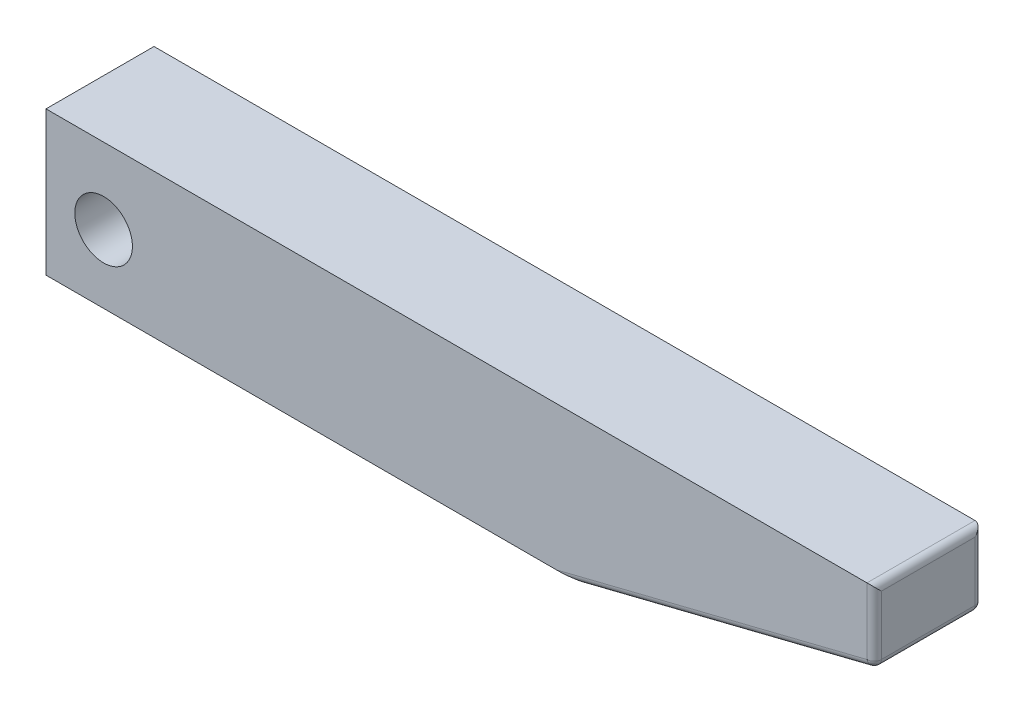
ISO-10303-21;
HEADER;
FILE_DESCRIPTION(('STEP AP214'),'2;1');
FILE_NAME('part.step','',(''),(''),'','','');
FILE_SCHEMA(('AUTOMOTIVE_DESIGN { 1 0 10303 214 1 1 1 1 }'));
ENDSEC;
DATA;
#1=APPLICATION_CONTEXT('core data for automotive mechanical design processes');
#2=APPLICATION_PROTOCOL_DEFINITION('international standard','automotive_design',2000,#1);
#3=PRODUCT_CONTEXT('',#1,'mechanical');
#4=PRODUCT('Part','Part','',(#3));
#5=PRODUCT_RELATED_PRODUCT_CATEGORY('part','',(#4));
#6=PRODUCT_DEFINITION_FORMATION('','',#4);
#7=PRODUCT_DEFINITION_CONTEXT('part definition',#1,'design');
#8=PRODUCT_DEFINITION('design','',#6,#7);
#9=PRODUCT_DEFINITION_SHAPE('','',#8);
#10=(LENGTH_UNIT() NAMED_UNIT(*) SI_UNIT(.MILLI.,.METRE.));
#11=(NAMED_UNIT(*) PLANE_ANGLE_UNIT() SI_UNIT($,.RADIAN.));
#12=(NAMED_UNIT(*) SI_UNIT($,.STERADIAN.) SOLID_ANGLE_UNIT());
#13=UNCERTAINTY_MEASURE_WITH_UNIT(LENGTH_MEASURE(1.E-05),#10,'distance_accuracy_value','');
#14=(GEOMETRIC_REPRESENTATION_CONTEXT(3) GLOBAL_UNCERTAINTY_ASSIGNED_CONTEXT((#13)) GLOBAL_UNIT_ASSIGNED_CONTEXT((#10,
#11,#12)) REPRESENTATION_CONTEXT('',''));
#15=CARTESIAN_POINT('',(0.,0.,0.));
#16=DIRECTION('',(0.,0.,1.));
#17=DIRECTION('',(1.,0.,0.));
#18=AXIS2_PLACEMENT_3D('',#15,#16,#17);
#19=CARTESIAN_POINT('',(0.,0.2,0.075));
#20=DIRECTION('',(1.,0.,0.));
#21=DIRECTION('',(0.,0.,-1.));
#22=AXIS2_PLACEMENT_3D('',#19,#20,#21);
#23=PLANE('',#22);
#24=DIRECTION('',(0.,0.,1.));
#25=VECTOR('',#24,1.);
#26=CARTESIAN_POINT('',(0.,0.,0.075));
#27=LINE('',#26,#25);
#28=CARTESIAN_POINT('',(0.,0.,-0.075));
#29=VERTEX_POINT('',#28);
#30=CARTESIAN_POINT('',(0.,0.,0.075));
#31=VERTEX_POINT('',#30);
#32=EDGE_CURVE('E152',#29,#31,#27,.T.);
#33=ORIENTED_EDGE('',*,*,#32,.T.);
#34=DIRECTION('',(0.,-1.,0.));
#35=VECTOR('',#34,1.);
#36=CARTESIAN_POINT('',(0.,0.2,0.075));
#37=LINE('',#36,#35);
#38=CARTESIAN_POINT('',(0.,0.2,0.075));
#39=VERTEX_POINT('',#38);
#40=EDGE_CURVE('E133',#39,#31,#37,.T.);
#41=ORIENTED_EDGE('',*,*,#40,.F.);
#42=DIRECTION('',(0.,0.,1.));
#43=VECTOR('',#42,1.);
#44=CARTESIAN_POINT('',(0.,0.2,0.075));
#45=LINE('',#44,#43);
#46=CARTESIAN_POINT('',(0.,0.2,-0.075));
#47=VERTEX_POINT('',#46);
#48=EDGE_CURVE('E141',#47,#39,#45,.T.);
#49=ORIENTED_EDGE('',*,*,#48,.F.);
#50=DIRECTION('',(0.,-1.,0.));
#51=VECTOR('',#50,1.);
#52=CARTESIAN_POINT('',(0.,0.2,-0.075));
#53=LINE('',#52,#51);
#54=EDGE_CURVE('E154',#47,#29,#53,.T.);
#55=ORIENTED_EDGE('',*,*,#54,.T.);
#56=EDGE_LOOP('',(#33,#41,#49,#55));
#57=FACE_BOUND('',#56,.T.);
#58=ADVANCED_FACE('F53',(#57),#23,.F.);
#59=CARTESIAN_POINT('',(1.15,0.2,0.0749999999999995));
#60=DIRECTION('',(0.,0.,-1.));
#61=DIRECTION('',(-1.,0.,0.));
#62=AXIS2_PLACEMENT_3D('',#59,#60,#61);
#63=PLANE('',#62);
#64=CARTESIAN_POINT('',(0.08,0.0946832685118679,0.075));
#65=DIRECTION('',(0.,0.,1.));
#66=DIRECTION('',(1.,0.,0.));
#67=AXIS2_PLACEMENT_3D('',#64,#65,#66);
#68=CIRCLE('',#67,0.04);
#69=CARTESIAN_POINT('',(0.12,0.0946832685118679,0.075));
#70=VERTEX_POINT('',#69);
#71=EDGE_CURVE('E404',#70,#70,#68,.T.);
#72=ORIENTED_EDGE('',*,*,#71,.F.);
#73=EDGE_LOOP('',(#72));
#74=FACE_BOUND('',#73,.T.);
#75=DIRECTION('',(-0.970142500145332,-0.242535625036333,0.));
#76=VECTOR('',#75,1.);
#77=CARTESIAN_POINT('',(1.17110405551434,0.11558377794263,0.0749999999999995));
#78=LINE('',#77,#76);
#79=CARTESIAN_POINT('',(0.708768943743823,0.,0.0749999999999997));
#80=VERTEX_POINT('',#79);
#81=CARTESIAN_POINT('',(1.14,0.107807764064044,0.0749999999999995));
#82=VERTEX_POINT('',#81);
#83=EDGE_CURVE('E182',#80,#82,#78,.F.);
#84=ORIENTED_EDGE('',*,*,#83,.T.);
#85=DIRECTION('',(0.,-1.,0.));
#86=VECTOR('',#85,1.);
#87=CARTESIAN_POINT('',(1.14,0.2,0.0749999999999995));
#88=LINE('',#87,#86);
#89=CARTESIAN_POINT('',(1.14,0.2,0.0749999999999995));
#90=VERTEX_POINT('',#89);
#91=EDGE_CURVE('E136',#82,#90,#88,.F.);
#92=ORIENTED_EDGE('',*,*,#91,.T.);
#93=DIRECTION('',(1.,0.,0.));
#94=VECTOR('',#93,1.);
#95=CARTESIAN_POINT('',(1.15,0.2,0.0749999999999995));
#96=LINE('',#95,#94);
#97=EDGE_CURVE('E128',#39,#90,#96,.T.);
#98=ORIENTED_EDGE('',*,*,#97,.F.);
#99=ORIENTED_EDGE('',*,*,#40,.T.);
#100=DIRECTION('',(1.,0.,0.));
#101=VECTOR('',#100,1.);
#102=CARTESIAN_POINT('',(1.15,0.,0.0749999999999995));
#103=LINE('',#102,#101);
#104=EDGE_CURVE('E218',#31,#80,#103,.T.);
#105=ORIENTED_EDGE('',*,*,#104,.T.);
#106=EDGE_LOOP('',(#84,#92,#98,#99,#105));
#107=FACE_BOUND('',#106,.T.);
#108=ADVANCED_FACE('F130',(#74,#107),#63,.F.);
#109=CARTESIAN_POINT('',(1.15,0.2,-0.075));
#110=DIRECTION('',(-1.,0.,0.));
#111=DIRECTION('',(0.,0.,1.));
#112=AXIS2_PLACEMENT_3D('',#109,#110,#111);
#113=PLANE('',#112);
#114=DIRECTION('',(0.,-1.,0.));
#115=VECTOR('',#114,1.);
#116=CARTESIAN_POINT('',(1.15,0.2,-0.065));
#117=LINE('',#116,#115);
#118=CARTESIAN_POINT('',(1.15,0.107807764064044,-0.065));
#119=VERTEX_POINT('',#118);
#120=CARTESIAN_POINT('',(1.15,0.19,-0.065));
#121=VERTEX_POINT('',#120);
#122=EDGE_CURVE('E164',#119,#121,#117,.F.);
#123=ORIENTED_EDGE('',*,*,#122,.T.);
#124=DIRECTION('',(0.,0.,-1.));
#125=VECTOR('',#124,1.);
#126=CARTESIAN_POINT('',(1.15,0.19,-0.075));
#127=LINE('',#126,#125);
#128=CARTESIAN_POINT('',(1.15,0.19,0.0649999999999995));
#129=VERTEX_POINT('',#128);
#130=EDGE_CURVE('E166',#121,#129,#127,.F.);
#131=ORIENTED_EDGE('',*,*,#130,.T.);
#132=DIRECTION('',(0.,-1.,0.));
#133=VECTOR('',#132,1.);
#134=CARTESIAN_POINT('',(1.15,0.2,0.0649999999999995));
#135=LINE('',#134,#133);
#136=CARTESIAN_POINT('',(1.15,0.107807764064044,0.0649999999999995));
#137=VERTEX_POINT('',#136);
#138=EDGE_CURVE('E156',#129,#137,#135,.T.);
#139=ORIENTED_EDGE('',*,*,#138,.T.);
#140=DIRECTION('',(0.,0.,1.));
#141=VECTOR('',#140,1.);
#142=CARTESIAN_POINT('',(1.15,0.107807764064044,-0.075));
#143=LINE('',#142,#141);
#144=EDGE_CURVE('E162',#137,#119,#143,.F.);
#145=ORIENTED_EDGE('',*,*,#144,.T.);
#146=EDGE_LOOP('',(#123,#131,#139,#145));
#147=FACE_BOUND('',#146,.T.);
#148=ADVANCED_FACE('F252',(#147),#113,.F.);
#149=CARTESIAN_POINT('',(0.,0.2,-0.075));
#150=DIRECTION('',(0.,0.,1.));
#151=DIRECTION('',(1.,0.,0.));
#152=AXIS2_PLACEMENT_3D('',#149,#150,#151);
#153=PLANE('',#152);
#154=CARTESIAN_POINT('',(0.08,0.0946832685118679,-0.075));
#155=DIRECTION('',(0.,0.,1.));
#156=DIRECTION('',(1.,0.,0.));
#157=AXIS2_PLACEMENT_3D('',#154,#155,#156);
#158=CIRCLE('',#157,0.04);
#159=CARTESIAN_POINT('',(0.12,0.0946832685118679,-0.075));
#160=VERTEX_POINT('',#159);
#161=EDGE_CURVE('E191',#160,#160,#158,.T.);
#162=ORIENTED_EDGE('',*,*,#161,.T.);
#163=EDGE_LOOP('',(#162));
#164=FACE_BOUND('',#163,.T.);
#165=DIRECTION('',(-1.,0.,0.));
#166=VECTOR('',#165,1.);
#167=CARTESIAN_POINT('',(0.,0.2,-0.075));
#168=LINE('',#167,#166);
#169=CARTESIAN_POINT('',(1.14,0.2,-0.075));
#170=VERTEX_POINT('',#169);
#171=EDGE_CURVE('E140',#170,#47,#168,.T.);
#172=ORIENTED_EDGE('',*,*,#171,.F.);
#173=DIRECTION('',(0.,-1.,0.));
#174=VECTOR('',#173,1.);
#175=CARTESIAN_POINT('',(1.14,0.2,-0.075));
#176=LINE('',#175,#174);
#177=CARTESIAN_POINT('',(1.14,0.107807764064044,-0.075));
#178=VERTEX_POINT('',#177);
#179=EDGE_CURVE('E171',#170,#178,#176,.T.);
#180=ORIENTED_EDGE('',*,*,#179,.T.);
#181=DIRECTION('',(-0.970142500145332,-0.242535625036333,0.));
#182=VECTOR('',#181,1.);
#183=CARTESIAN_POINT('',(0.088751114337872,-0.155004457351488,-0.075));
#184=LINE('',#183,#182);
#185=CARTESIAN_POINT('',(0.708768943743823,0.,-0.075));
#186=VERTEX_POINT('',#185);
#187=EDGE_CURVE('E169',#178,#186,#184,.T.);
#188=ORIENTED_EDGE('',*,*,#187,.T.);
#189=DIRECTION('',(-1.,0.,0.));
#190=VECTOR('',#189,1.);
#191=CARTESIAN_POINT('',(0.,0.,-0.075));
#192=LINE('',#191,#190);
#193=EDGE_CURVE('E149',#186,#29,#192,.T.);
#194=ORIENTED_EDGE('',*,*,#193,.T.);
#195=ORIENTED_EDGE('',*,*,#54,.F.);
#196=EDGE_LOOP('',(#172,#180,#188,#194,#195));
#197=FACE_BOUND('',#196,.T.);
#198=ADVANCED_FACE('F223',(#164,#197),#153,.F.);
#199=CARTESIAN_POINT('',(0.,0.2,0.));
#200=DIRECTION('',(0.,-1.,0.));
#201=DIRECTION('',(0.,0.,-1.));
#202=AXIS2_PLACEMENT_3D('',#199,#200,#201);
#203=PLANE('',#202);
#204=ORIENTED_EDGE('',*,*,#97,.T.);
#205=DIRECTION('',(0.,0.,-1.));
#206=VECTOR('',#205,1.);
#207=CARTESIAN_POINT('',(1.14,0.2,0.));
#208=LINE('',#207,#206);
#209=EDGE_CURVE('E153',#90,#170,#208,.T.);
#210=ORIENTED_EDGE('',*,*,#209,.T.);
#211=ORIENTED_EDGE('',*,*,#171,.T.);
#212=ORIENTED_EDGE('',*,*,#48,.T.);
#213=EDGE_LOOP('',(#204,#210,#211,#212));
#214=FACE_BOUND('',#213,.T.);
#215=ADVANCED_FACE('F144',(#214),#203,.F.);
#216=CARTESIAN_POINT('',(0.,0.,0.));
#217=DIRECTION('',(0.,-1.,0.));
#218=DIRECTION('',(0.,0.,-1.));
#219=AXIS2_PLACEMENT_3D('',#216,#217,#218);
#220=PLANE('',#219);
#221=ORIENTED_EDGE('',*,*,#193,.F.);
#222=CARTESIAN_POINT('',(0.708768943743823,0.,-0.065));
#223=DIRECTION('',(0.,-1.,0.));
#224=DIRECTION('',(-1.,0.,0.));
#225=AXIS2_PLACEMENT_3D('',#222,#223,#224);
#226=ELLIPSE('',#225,0.0412310562561766,0.01);
#227=CARTESIAN_POINT('',(0.748768943743823,0.,-0.0674253562563381));
#228=VERTEX_POINT('',#227);
#229=EDGE_CURVE('E13',#186,#228,#226,.T.);
#230=ORIENTED_EDGE('',*,*,#229,.T.);
#231=DIRECTION('',(0.,0.,1.));
#232=VECTOR('',#231,1.);
#233=CARTESIAN_POINT('',(0.748768943743823,0.,0.0749999999999997));
#234=LINE('',#233,#232);
#235=CARTESIAN_POINT('',(0.748768943743823,0.,0.0674253562563377));
#236=VERTEX_POINT('',#235);
#237=EDGE_CURVE('E62',#228,#236,#234,.T.);
#238=ORIENTED_EDGE('',*,*,#237,.T.);
#239=CARTESIAN_POINT('',(0.708768943743823,0.,0.0649999999999997));
#240=DIRECTION('',(0.,-1.,0.));
#241=DIRECTION('',(-1.,0.,0.));
#242=AXIS2_PLACEMENT_3D('',#239,#240,#241);
#243=ELLIPSE('',#242,0.0412310562561766,0.01);
#244=EDGE_CURVE('E185',#236,#80,#243,.T.);
#245=ORIENTED_EDGE('',*,*,#244,.T.);
#246=ORIENTED_EDGE('',*,*,#104,.F.);
#247=ORIENTED_EDGE('',*,*,#32,.F.);
#248=EDGE_LOOP('',(#221,#230,#238,#245,#246,#247));
#249=FACE_BOUND('',#248,.T.);
#250=ADVANCED_FACE('F225',(#249),#220,.T.);
#251=CARTESIAN_POINT('',(0.75,0.,-0.075));
#252=DIRECTION('',(-0.242535625036333,0.970142500145332,0.));
#253=DIRECTION('',(-0.970142500145332,-0.242535625036333,0.));
#254=AXIS2_PLACEMENT_3D('',#251,#252,#253);
#255=PLANE('',#254);
#256=DIRECTION('',(0.,0.,1.));
#257=VECTOR('',#256,1.);
#258=CARTESIAN_POINT('',(0.751194299994187,0.000298574998546664,-0.075));
#259=LINE('',#258,#257);
#260=CARTESIAN_POINT('',(0.751194299994187,0.000298574998546663,0.0649999999999997));
#261=VERTEX_POINT('',#260);
#262=CARTESIAN_POINT('',(0.751194299994187,0.000298574998546664,-0.065));
#263=VERTEX_POINT('',#262);
#264=EDGE_CURVE('E175',#261,#263,#259,.F.);
#265=ORIENTED_EDGE('',*,*,#264,.T.);
#266=DIRECTION('',(-0.970142500145332,-0.242535625036333,0.));
#267=VECTOR('',#266,1.);
#268=CARTESIAN_POINT('',(0.75,0.,-0.065));
#269=LINE('',#268,#267);
#270=CARTESIAN_POINT('',(1.14242535625036,0.0981063390625908,-0.065));
#271=VERTEX_POINT('',#270);
#272=EDGE_CURVE('E180',#263,#271,#269,.F.);
#273=ORIENTED_EDGE('',*,*,#272,.T.);
#274=DIRECTION('',(0.,0.,1.));
#275=VECTOR('',#274,1.);
#276=CARTESIAN_POINT('',(1.14242535625036,0.0981063390625908,-0.075));
#277=LINE('',#276,#275);
#278=CARTESIAN_POINT('',(1.14242535625036,0.0981063390625908,0.0649999999999995));
#279=VERTEX_POINT('',#278);
#280=EDGE_CURVE('E177',#271,#279,#277,.T.);
#281=ORIENTED_EDGE('',*,*,#280,.T.);
#282=DIRECTION('',(-0.970142500145332,-0.242535625036333,0.));
#283=VECTOR('',#282,1.);
#284=CARTESIAN_POINT('',(0.75,0.,0.0649999999999997));
#285=LINE('',#284,#283);
#286=EDGE_CURVE('E173',#279,#261,#285,.T.);
#287=ORIENTED_EDGE('',*,*,#286,.T.);
#288=EDGE_LOOP('',(#265,#273,#281,#287));
#289=FACE_BOUND('',#288,.T.);
#290=ADVANCED_FACE('F258',(#289),#255,.F.);
#291=CARTESIAN_POINT('',(0.748768943743823,0.01,0.));
#292=DIRECTION('',(0.,0.,-1.));
#293=DIRECTION('',(-1.,0.,0.));
#294=AXIS2_PLACEMENT_3D('',#291,#292,#293);
#295=CYLINDRICAL_SURFACE('',#294,0.01);
#296=CARTESIAN_POINT('',(0.748768943743823,0.00999999999999999,-0.065));
#297=DIRECTION('',(-0.685994340570035,-0.171498585142509,0.707106781186547));
#298=DIRECTION('',(-0.685994340570035,-0.171498585142509,-0.707106781186547));
#299=AXIS2_PLACEMENT_3D('',#296,#297,#298);
#300=ELLIPSE('',#299,0.014142135623731,0.01);
#301=EDGE_CURVE('E209',#263,#228,#300,.F.);
#302=ORIENTED_EDGE('',*,*,#301,.F.);
#303=ORIENTED_EDGE('',*,*,#264,.F.);
#304=CARTESIAN_POINT('',(0.748768943743823,0.01,0.0649999999999997));
#305=DIRECTION('',(-0.685994340570035,-0.171498585142509,-0.707106781186547));
#306=DIRECTION('',(-0.685994340570035,-0.171498585142509,0.707106781186548));
#307=AXIS2_PLACEMENT_3D('',#304,#305,#306);
#308=ELLIPSE('',#307,0.014142135623731,0.01);
#309=EDGE_CURVE('E57',#236,#261,#308,.F.);
#310=ORIENTED_EDGE('',*,*,#309,.F.);
#311=ORIENTED_EDGE('',*,*,#237,.F.);
#312=EDGE_LOOP('',(#302,#303,#310,#311));
#313=FACE_BOUND('',#312,.T.);
#314=ADVANCED_FACE('F55',(#313),#295,.T.);
#315=CARTESIAN_POINT('',(0.747574643749637,0.00970142500145333,0.0649999999999997));
#316=DIRECTION('',(-0.970142500145332,-0.242535625036333,0.));
#317=DIRECTION('',(0.242535625036333,-0.970142500145332,0.));
#318=AXIS2_PLACEMENT_3D('',#315,#316,#317);
#319=CYLINDRICAL_SURFACE('',#318,0.01);
#320=ORIENTED_EDGE('',*,*,#309,.T.);
#321=ORIENTED_EDGE('',*,*,#286,.F.);
#322=CARTESIAN_POINT('',(1.14,0.107807764064044,0.0649999999999995));
#323=DIRECTION('',(0.970142500145332,0.242535625036332,0.));
#324=DIRECTION('',(-0.242535625036332,0.970142500145332,0.));
#325=AXIS2_PLACEMENT_3D('',#322,#323,#324);
#326=CIRCLE('',#325,0.01);
#327=EDGE_CURVE('E205',#82,#279,#326,.T.);
#328=ORIENTED_EDGE('',*,*,#327,.F.);
#329=ORIENTED_EDGE('',*,*,#83,.F.);
#330=ORIENTED_EDGE('',*,*,#244,.F.);
#331=EDGE_LOOP('',(#320,#321,#328,#329,#330));
#332=FACE_BOUND('',#331,.T.);
#333=ADVANCED_FACE('F228',(#332),#319,.T.);
#334=CARTESIAN_POINT('',(0.088751114337872,-0.155004457351488,-0.065));
#335=DIRECTION('',(-0.970142500145332,-0.242535625036333,0.));
#336=DIRECTION('',(0.242535625036333,-0.970142500145332,0.));
#337=AXIS2_PLACEMENT_3D('',#334,#335,#336);
#338=CYLINDRICAL_SURFACE('',#337,0.01);
#339=ORIENTED_EDGE('',*,*,#229,.F.);
#340=ORIENTED_EDGE('',*,*,#187,.F.);
#341=CARTESIAN_POINT('',(1.14,0.107807764064044,-0.065));
#342=DIRECTION('',(0.970142500145332,0.242535625036332,0.));
#343=DIRECTION('',(-0.242535625036332,0.970142500145332,0.));
#344=AXIS2_PLACEMENT_3D('',#341,#342,#343);
#345=CIRCLE('',#344,0.01);
#346=EDGE_CURVE('E202',#271,#178,#345,.T.);
#347=ORIENTED_EDGE('',*,*,#346,.F.);
#348=ORIENTED_EDGE('',*,*,#272,.F.);
#349=ORIENTED_EDGE('',*,*,#301,.T.);
#350=EDGE_LOOP('',(#339,#340,#347,#348,#349));
#351=FACE_BOUND('',#350,.T.);
#352=ADVANCED_FACE('F244',(#351),#338,.T.);
#353=CARTESIAN_POINT('',(1.14,0.107807764064044,-0.075));
#354=DIRECTION('',(0.,0.,1.));
#355=DIRECTION('',(1.,0.,0.));
#356=AXIS2_PLACEMENT_3D('',#353,#354,#355);
#357=CYLINDRICAL_SURFACE('',#356,0.01);
#358=CARTESIAN_POINT('',(1.14,0.107807764064044,0.0649999999999995));
#359=DIRECTION('',(0.,0.,1.));
#360=DIRECTION('',(1.,0.,0.));
#361=AXIS2_PLACEMENT_3D('',#358,#359,#360);
#362=CIRCLE('',#361,0.01);
#363=EDGE_CURVE('E207',#279,#137,#362,.T.);
#364=ORIENTED_EDGE('',*,*,#363,.F.);
#365=ORIENTED_EDGE('',*,*,#280,.F.);
#366=CARTESIAN_POINT('',(1.14,0.107807764064044,-0.065));
#367=DIRECTION('',(0.,0.,-1.));
#368=DIRECTION('',(-1.,0.,0.));
#369=AXIS2_PLACEMENT_3D('',#366,#367,#368);
#370=CIRCLE('',#369,0.01);
#371=EDGE_CURVE('E199',#119,#271,#370,.T.);
#372=ORIENTED_EDGE('',*,*,#371,.F.);
#373=ORIENTED_EDGE('',*,*,#144,.F.);
#374=EDGE_LOOP('',(#364,#365,#372,#373));
#375=FACE_BOUND('',#374,.T.);
#376=ADVANCED_FACE('F256',(#375),#357,.T.);
#377=CARTESIAN_POINT('',(1.14,0.107807764064044,0.0649999999999995));
#378=DIRECTION('',(0.,0.,1.));
#379=DIRECTION('',(0.,-1.,0.));
#380=AXIS2_PLACEMENT_3D('',#377,#378,#379);
#381=SPHERICAL_SURFACE('',#380,0.01);
#382=ORIENTED_EDGE('',*,*,#327,.T.);
#383=ORIENTED_EDGE('',*,*,#363,.T.);
#384=CARTESIAN_POINT('',(1.14,0.107807764064044,0.0649999999999995));
#385=DIRECTION('',(0.,-1.,0.));
#386=DIRECTION('',(0.,0.,-1.));
#387=AXIS2_PLACEMENT_3D('',#384,#385,#386);
#388=CIRCLE('',#387,0.01);
#389=EDGE_CURVE('E196',#82,#137,#388,.F.);
#390=ORIENTED_EDGE('',*,*,#389,.F.);
#391=EDGE_LOOP('',(#382,#383,#390));
#392=FACE_BOUND('',#391,.T.);
#393=ADVANCED_FACE('F232',(#392),#381,.T.);
#394=CARTESIAN_POINT('',(1.14,0.107807764064044,-0.065));
#395=DIRECTION('',(0.,0.,-1.));
#396=DIRECTION('',(0.,1.,0.));
#397=AXIS2_PLACEMENT_3D('',#394,#395,#396);
#398=SPHERICAL_SURFACE('',#397,0.01);
#399=ORIENTED_EDGE('',*,*,#371,.T.);
#400=ORIENTED_EDGE('',*,*,#346,.T.);
#401=CARTESIAN_POINT('',(1.14,0.107807764064044,-0.065));
#402=DIRECTION('',(0.,-1.,0.));
#403=DIRECTION('',(1.,0.,0.));
#404=AXIS2_PLACEMENT_3D('',#401,#402,#403);
#405=CIRCLE('',#404,0.01);
#406=EDGE_CURVE('E193',#119,#178,#405,.F.);
#407=ORIENTED_EDGE('',*,*,#406,.F.);
#408=EDGE_LOOP('',(#399,#400,#407));
#409=FACE_BOUND('',#408,.T.);
#410=ADVANCED_FACE('F247',(#409),#398,.T.);
#411=CARTESIAN_POINT('',(1.14,0.2,0.0649999999999995));
#412=DIRECTION('',(0.,-1.,0.));
#413=DIRECTION('',(0.,0.,-1.));
#414=AXIS2_PLACEMENT_3D('',#411,#412,#413);
#415=CYLINDRICAL_SURFACE('',#414,0.01);
#416=ORIENTED_EDGE('',*,*,#389,.T.);
#417=ORIENTED_EDGE('',*,*,#138,.F.);
#418=CARTESIAN_POINT('',(1.14,0.19,0.0649999999999995));
#419=DIRECTION('',(0.,-0.707106781186547,0.707106781186547));
#420=DIRECTION('',(0.,-0.707106781186547,-0.707106781186547));
#421=AXIS2_PLACEMENT_3D('',#418,#419,#420);
#422=ELLIPSE('',#421,0.014142135623731,0.01);
#423=EDGE_CURVE('E190',#90,#129,#422,.F.);
#424=ORIENTED_EDGE('',*,*,#423,.F.);
#425=ORIENTED_EDGE('',*,*,#91,.F.);
#426=EDGE_LOOP('',(#416,#417,#424,#425));
#427=FACE_BOUND('',#426,.T.);
#428=ADVANCED_FACE('F235',(#427),#415,.T.);
#429=CARTESIAN_POINT('',(1.14,0.2,-0.065));
#430=DIRECTION('',(0.,-1.,0.));
#431=DIRECTION('',(0.,0.,-1.));
#432=AXIS2_PLACEMENT_3D('',#429,#430,#431);
#433=CYLINDRICAL_SURFACE('',#432,0.01);
#434=ORIENTED_EDGE('',*,*,#406,.T.);
#435=ORIENTED_EDGE('',*,*,#179,.F.);
#436=CARTESIAN_POINT('',(1.14,0.19,-0.065));
#437=DIRECTION('',(0.,-0.707106781186547,-0.707106781186547));
#438=DIRECTION('',(0.,-0.707106781186547,0.707106781186547));
#439=AXIS2_PLACEMENT_3D('',#436,#437,#438);
#440=ELLIPSE('',#439,0.014142135623731,0.01);
#441=EDGE_CURVE('E188',#121,#170,#440,.F.);
#442=ORIENTED_EDGE('',*,*,#441,.F.);
#443=ORIENTED_EDGE('',*,*,#122,.F.);
#444=EDGE_LOOP('',(#434,#435,#442,#443));
#445=FACE_BOUND('',#444,.T.);
#446=ADVANCED_FACE('F250',(#445),#433,.T.);
#447=CARTESIAN_POINT('',(1.14,0.19,0.));
#448=DIRECTION('',(0.,0.,-1.));
#449=DIRECTION('',(-1.,0.,0.));
#450=AXIS2_PLACEMENT_3D('',#447,#448,#449);
#451=CYLINDRICAL_SURFACE('',#450,0.01);
#452=ORIENTED_EDGE('',*,*,#423,.T.);
#453=ORIENTED_EDGE('',*,*,#130,.F.);
#454=ORIENTED_EDGE('',*,*,#441,.T.);
#455=ORIENTED_EDGE('',*,*,#209,.F.);
#456=EDGE_LOOP('',(#452,#453,#454,#455));
#457=FACE_BOUND('',#456,.T.);
#458=ADVANCED_FACE('F239',(#457),#451,.T.);
#459=CARTESIAN_POINT('',(0.08,0.0946832685118679,-0.075));
#460=DIRECTION('',(0.,0.,1.));
#461=DIRECTION('',(1.,0.,0.));
#462=AXIS2_PLACEMENT_3D('',#459,#460,#461);
#463=CYLINDRICAL_SURFACE('',#462,0.04);
#464=ORIENTED_EDGE('',*,*,#161,.F.);
#465=EDGE_LOOP('',(#464));
#466=FACE_BOUND('',#465,.T.);
#467=ORIENTED_EDGE('',*,*,#71,.T.);
#468=EDGE_LOOP('',(#467));
#469=FACE_BOUND('',#468,.T.);
#470=ADVANCED_FACE('F279',(#466,#469),#463,.F.);
#471=CLOSED_SHELL('',(#58,#108,#148,#198,#215,#250,#290,#314,#333,#352,#376,#393,#410,#428,#446,
#458,#470));
#472=MANIFOLD_SOLID_BREP('B2',#471);
#473=ADVANCED_BREP_SHAPE_REPRESENTATION('',(#18,#472),#14);
#474=SHAPE_DEFINITION_REPRESENTATION(#9,#473);
ENDSEC;
END-ISO-10303-21;
